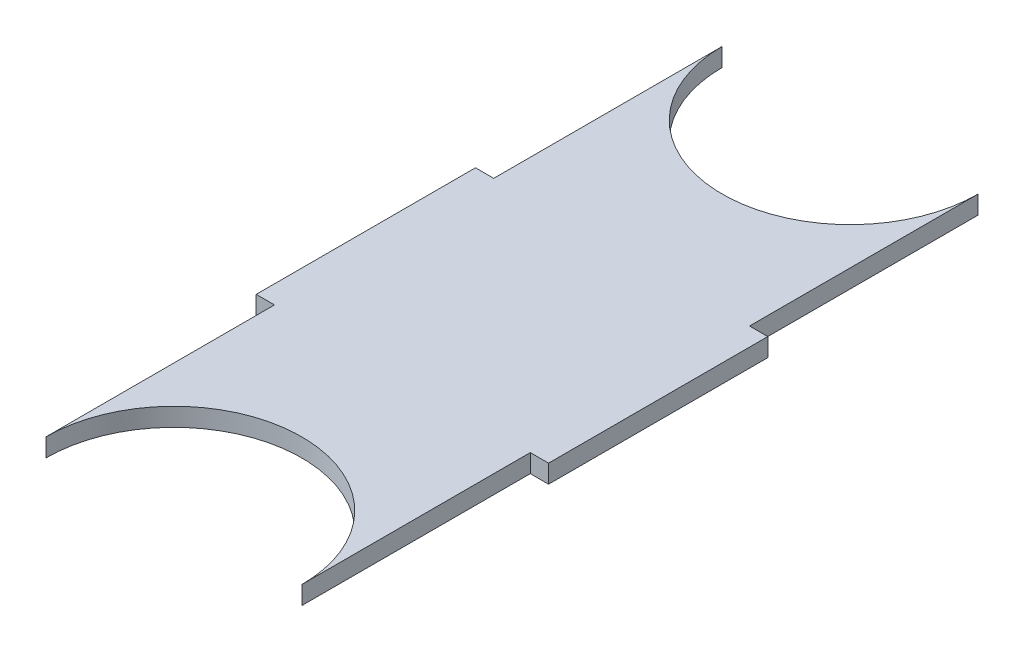
ISO-10303-21;
HEADER;
FILE_DESCRIPTION(('STEP AP214'),'2;1');
FILE_NAME('part.step','',(''),(''),'','','');
FILE_SCHEMA(('AUTOMOTIVE_DESIGN { 1 0 10303 214 1 1 1 1 }'));
ENDSEC;
DATA;
#1=APPLICATION_CONTEXT('core data for automotive mechanical design processes');
#2=APPLICATION_PROTOCOL_DEFINITION('international standard','automotive_design',2000,#1);
#3=PRODUCT_CONTEXT('',#1,'mechanical');
#4=PRODUCT('Part','Part','',(#3));
#5=PRODUCT_RELATED_PRODUCT_CATEGORY('part','',(#4));
#6=PRODUCT_DEFINITION_FORMATION('','',#4);
#7=PRODUCT_DEFINITION_CONTEXT('part definition',#1,'design');
#8=PRODUCT_DEFINITION('design','',#6,#7);
#9=PRODUCT_DEFINITION_SHAPE('','',#8);
#10=(LENGTH_UNIT() NAMED_UNIT(*) SI_UNIT(.MILLI.,.METRE.));
#11=(NAMED_UNIT(*) PLANE_ANGLE_UNIT() SI_UNIT($,.RADIAN.));
#12=(NAMED_UNIT(*) SI_UNIT($,.STERADIAN.) SOLID_ANGLE_UNIT());
#13=UNCERTAINTY_MEASURE_WITH_UNIT(LENGTH_MEASURE(1.E-05),#10,'distance_accuracy_value','');
#14=(GEOMETRIC_REPRESENTATION_CONTEXT(3) GLOBAL_UNCERTAINTY_ASSIGNED_CONTEXT((#13)) GLOBAL_UNIT_ASSIGNED_CONTEXT((#10,
#11,#12)) REPRESENTATION_CONTEXT('',''));
#15=CARTESIAN_POINT('',(0.,0.,0.));
#16=DIRECTION('',(0.,0.,1.));
#17=DIRECTION('',(1.,0.,0.));
#18=AXIS2_PLACEMENT_3D('',#15,#16,#17);
#19=CARTESIAN_POINT('',(11.1125,1.5875,0.));
#20=DIRECTION('',(1.,0.,0.));
#21=DIRECTION('',(0.,0.,-1.));
#22=AXIS2_PLACEMENT_3D('',#19,#20,#21);
#23=PLANE('',#22);
#24=DIRECTION('',(0.,0.,1.));
#25=VECTOR('',#24,1.);
#26=CARTESIAN_POINT('',(11.1125,0.,0.));
#27=LINE('',#26,#25);
#28=CARTESIAN_POINT('',(11.1125,0.,-27.7886697009627));
#29=VERTEX_POINT('',#28);
#30=CARTESIAN_POINT('',(11.1125,0.,-7.9375));
#31=VERTEX_POINT('',#30);
#32=EDGE_CURVE('E165',#29,#31,#27,.T.);
#33=ORIENTED_EDGE('',*,*,#32,.F.);
#34=DIRECTION('',(0.,-1.,0.));
#35=VECTOR('',#34,1.);
#36=CARTESIAN_POINT('',(11.1125,1.5875,-27.7886697009627));
#37=LINE('',#36,#35);
#38=CARTESIAN_POINT('',(11.1125,1.5875,-27.7886697009627));
#39=VERTEX_POINT('',#38);
#40=EDGE_CURVE('E11',#39,#29,#37,.T.);
#41=ORIENTED_EDGE('',*,*,#40,.F.);
#42=DIRECTION('',(0.,0.,1.));
#43=VECTOR('',#42,1.);
#44=CARTESIAN_POINT('',(11.1125,1.5875,0.));
#45=LINE('',#44,#43);
#46=CARTESIAN_POINT('',(11.1125,1.5875,-7.9375));
#47=VERTEX_POINT('',#46);
#48=EDGE_CURVE('E194',#39,#47,#45,.T.);
#49=ORIENTED_EDGE('',*,*,#48,.T.);
#50=DIRECTION('',(0.,-1.,0.));
#51=VECTOR('',#50,1.);
#52=CARTESIAN_POINT('',(11.1125,1.5875,-7.9375));
#53=LINE('',#52,#51);
#54=EDGE_CURVE('E58',#47,#31,#53,.T.);
#55=ORIENTED_EDGE('',*,*,#54,.T.);
#56=EDGE_LOOP('',(#33,#41,#49,#55));
#57=FACE_BOUND('',#56,.T.);
#58=ADVANCED_FACE('F41',(#57),#23,.T.);
#59=CARTESIAN_POINT('',(0.,1.5875,-27.7886697009627));
#60=DIRECTION('',(0.,-1.,0.));
#61=DIRECTION('',(0.,0.,-1.));
#62=AXIS2_PLACEMENT_3D('',#59,#60,#61);
#63=CYLINDRICAL_SURFACE('',#62,11.1125);
#64=CARTESIAN_POINT('',(0.,0.,-27.7886697009627));
#65=DIRECTION('',(0.,1.,0.));
#66=DIRECTION('',(0.,0.,1.));
#67=AXIS2_PLACEMENT_3D('',#64,#65,#66);
#68=CIRCLE('',#67,11.1125);
#69=CARTESIAN_POINT('',(-11.1125,0.,-27.7886697009627));
#70=VERTEX_POINT('',#69);
#71=EDGE_CURVE('E167',#29,#70,#68,.F.);
#72=ORIENTED_EDGE('',*,*,#71,.T.);
#73=DIRECTION('',(0.,-1.,0.));
#74=VECTOR('',#73,1.);
#75=CARTESIAN_POINT('',(-11.1125,1.5875,-27.7886697009627));
#76=LINE('',#75,#74);
#77=CARTESIAN_POINT('',(-11.1125,1.5875,-27.7886697009627));
#78=VERTEX_POINT('',#77);
#79=EDGE_CURVE('E50',#78,#70,#76,.T.);
#80=ORIENTED_EDGE('',*,*,#79,.F.);
#81=CARTESIAN_POINT('',(0.,1.5875,-27.7886697009627));
#82=DIRECTION('',(0.,1.,0.));
#83=DIRECTION('',(0.,0.,1.));
#84=AXIS2_PLACEMENT_3D('',#81,#82,#83);
#85=CIRCLE('',#84,11.1125);
#86=EDGE_CURVE('E239',#39,#78,#85,.F.);
#87=ORIENTED_EDGE('',*,*,#86,.F.);
#88=ORIENTED_EDGE('',*,*,#40,.T.);
#89=EDGE_LOOP('',(#72,#80,#87,#88));
#90=FACE_BOUND('',#89,.T.);
#91=ADVANCED_FACE('F43',(#90),#63,.F.);
#92=CARTESIAN_POINT('',(-11.1125,1.5875,0.));
#93=DIRECTION('',(1.,0.,0.));
#94=DIRECTION('',(0.,0.,-1.));
#95=AXIS2_PLACEMENT_3D('',#92,#93,#94);
#96=PLANE('',#95);
#97=DIRECTION('',(0.,0.,1.));
#98=VECTOR('',#97,1.);
#99=CARTESIAN_POINT('',(-11.1125,0.,0.));
#100=LINE('',#99,#98);
#101=CARTESIAN_POINT('',(-11.1125,0.,-7.93749999999999));
#102=VERTEX_POINT('',#101);
#103=EDGE_CURVE('E170',#70,#102,#100,.T.);
#104=ORIENTED_EDGE('',*,*,#103,.T.);
#105=DIRECTION('',(0.,-1.,0.));
#106=VECTOR('',#105,1.);
#107=CARTESIAN_POINT('',(-11.1125,1.5875,-7.93749999999999));
#108=LINE('',#107,#106);
#109=CARTESIAN_POINT('',(-11.1125,1.5875,-7.93749999999999));
#110=VERTEX_POINT('',#109);
#111=EDGE_CURVE('E211',#110,#102,#108,.T.);
#112=ORIENTED_EDGE('',*,*,#111,.F.);
#113=DIRECTION('',(0.,0.,1.));
#114=VECTOR('',#113,1.);
#115=CARTESIAN_POINT('',(-11.1125,1.5875,0.));
#116=LINE('',#115,#114);
#117=EDGE_CURVE('E220',#78,#110,#116,.T.);
#118=ORIENTED_EDGE('',*,*,#117,.F.);
#119=ORIENTED_EDGE('',*,*,#79,.T.);
#120=EDGE_LOOP('',(#104,#112,#118,#119));
#121=FACE_BOUND('',#120,.T.);
#122=ADVANCED_FACE('F218',(#121),#96,.F.);
#123=CARTESIAN_POINT('',(0.,1.5875,-7.93749999999999));
#124=DIRECTION('',(0.,0.,1.));
#125=DIRECTION('',(1.,0.,0.));
#126=AXIS2_PLACEMENT_3D('',#123,#124,#125);
#127=PLANE('',#126);
#128=DIRECTION('',(-1.,0.,0.));
#129=VECTOR('',#128,1.);
#130=CARTESIAN_POINT('',(0.,0.,-7.93749999999999));
#131=LINE('',#130,#129);
#132=CARTESIAN_POINT('',(-12.7,0.,-7.93749999999999));
#133=VERTEX_POINT('',#132);
#134=EDGE_CURVE('E172',#102,#133,#131,.T.);
#135=ORIENTED_EDGE('',*,*,#134,.T.);
#136=DIRECTION('',(0.,-1.,0.));
#137=VECTOR('',#136,1.);
#138=CARTESIAN_POINT('',(-12.7,1.5875,-7.93749999999999));
#139=LINE('',#138,#137);
#140=CARTESIAN_POINT('',(-12.7,1.5875,-7.93749999999999));
#141=VERTEX_POINT('',#140);
#142=EDGE_CURVE('E209',#141,#133,#139,.T.);
#143=ORIENTED_EDGE('',*,*,#142,.F.);
#144=DIRECTION('',(-1.,0.,0.));
#145=VECTOR('',#144,1.);
#146=CARTESIAN_POINT('',(0.,1.5875,-7.93749999999999));
#147=LINE('',#146,#145);
#148=EDGE_CURVE('E232',#110,#141,#147,.T.);
#149=ORIENTED_EDGE('',*,*,#148,.F.);
#150=ORIENTED_EDGE('',*,*,#111,.T.);
#151=EDGE_LOOP('',(#135,#143,#149,#150));
#152=FACE_BOUND('',#151,.T.);
#153=ADVANCED_FACE('F229',(#152),#127,.F.);
#154=CARTESIAN_POINT('',(-12.7,1.5875,0.));
#155=DIRECTION('',(-1.,0.,0.));
#156=DIRECTION('',(0.,0.,1.));
#157=AXIS2_PLACEMENT_3D('',#154,#155,#156);
#158=PLANE('',#157);
#159=DIRECTION('',(0.,0.,-1.));
#160=VECTOR('',#159,1.);
#161=CARTESIAN_POINT('',(-12.7,0.,0.));
#162=LINE('',#161,#160);
#163=CARTESIAN_POINT('',(-12.7,0.,11.1125));
#164=VERTEX_POINT('',#163);
#165=EDGE_CURVE('E176',#164,#133,#162,.T.);
#166=ORIENTED_EDGE('',*,*,#165,.F.);
#167=DIRECTION('',(0.,-1.,0.));
#168=VECTOR('',#167,1.);
#169=CARTESIAN_POINT('',(-12.7,1.5875,11.1125));
#170=LINE('',#169,#168);
#171=CARTESIAN_POINT('',(-12.7,1.5875,11.1125));
#172=VERTEX_POINT('',#171);
#173=EDGE_CURVE('E206',#172,#164,#170,.T.);
#174=ORIENTED_EDGE('',*,*,#173,.F.);
#175=DIRECTION('',(0.,0.,-1.));
#176=VECTOR('',#175,1.);
#177=CARTESIAN_POINT('',(-12.7,1.5875,0.));
#178=LINE('',#177,#176);
#179=EDGE_CURVE('E234',#172,#141,#178,.T.);
#180=ORIENTED_EDGE('',*,*,#179,.T.);
#181=ORIENTED_EDGE('',*,*,#142,.T.);
#182=EDGE_LOOP('',(#166,#174,#180,#181));
#183=FACE_BOUND('',#182,.T.);
#184=ADVANCED_FACE('F354',(#183),#158,.T.);
#185=CARTESIAN_POINT('',(0.,1.5875,11.1125));
#186=DIRECTION('',(0.,0.,1.));
#187=DIRECTION('',(1.,0.,0.));
#188=AXIS2_PLACEMENT_3D('',#185,#186,#187);
#189=PLANE('',#188);
#190=DIRECTION('',(-1.,0.,0.));
#191=VECTOR('',#190,1.);
#192=CARTESIAN_POINT('',(0.,0.,11.1125));
#193=LINE('',#192,#191);
#194=CARTESIAN_POINT('',(-11.1125,0.,11.1125));
#195=VERTEX_POINT('',#194);
#196=EDGE_CURVE('E180',#195,#164,#193,.T.);
#197=ORIENTED_EDGE('',*,*,#196,.F.);
#198=DIRECTION('',(0.,-1.,0.));
#199=VECTOR('',#198,1.);
#200=CARTESIAN_POINT('',(-11.1125,1.5875,11.1125));
#201=LINE('',#200,#199);
#202=CARTESIAN_POINT('',(-11.1125,1.5875,11.1125));
#203=VERTEX_POINT('',#202);
#204=EDGE_CURVE('E203',#203,#195,#201,.T.);
#205=ORIENTED_EDGE('',*,*,#204,.F.);
#206=DIRECTION('',(-1.,0.,0.));
#207=VECTOR('',#206,1.);
#208=CARTESIAN_POINT('',(0.,1.5875,11.1125));
#209=LINE('',#208,#207);
#210=EDGE_CURVE('E237',#203,#172,#209,.T.);
#211=ORIENTED_EDGE('',*,*,#210,.T.);
#212=ORIENTED_EDGE('',*,*,#173,.T.);
#213=EDGE_LOOP('',(#197,#205,#211,#212));
#214=FACE_BOUND('',#213,.T.);
#215=ADVANCED_FACE('F344',(#214),#189,.T.);
#216=CARTESIAN_POINT('',(-11.1125,0.,30.9636697009627));
#217=VERTEX_POINT('',#216);
#218=EDGE_CURVE('E173',#195,#217,#100,.T.);
#219=ORIENTED_EDGE('',*,*,#218,.T.);
#220=DIRECTION('',(0.,-1.,0.));
#221=VECTOR('',#220,1.);
#222=CARTESIAN_POINT('',(-11.1125,1.5875,30.9636697009627));
#223=LINE('',#222,#221);
#224=CARTESIAN_POINT('',(-11.1125,1.5875,30.9636697009627));
#225=VERTEX_POINT('',#224);
#226=EDGE_CURVE('E200',#225,#217,#223,.T.);
#227=ORIENTED_EDGE('',*,*,#226,.F.);
#228=EDGE_CURVE('E241',#203,#225,#116,.T.);
#229=ORIENTED_EDGE('',*,*,#228,.F.);
#230=ORIENTED_EDGE('',*,*,#204,.T.);
#231=EDGE_LOOP('',(#219,#227,#229,#230));
#232=FACE_BOUND('',#231,.T.);
#233=ADVANCED_FACE('F258',(#232),#96,.F.);
#234=CARTESIAN_POINT('',(0.,1.5875,30.9636697009627));
#235=DIRECTION('',(0.,-1.,0.));
#236=DIRECTION('',(0.,0.,-1.));
#237=AXIS2_PLACEMENT_3D('',#234,#235,#236);
#238=CYLINDRICAL_SURFACE('',#237,11.1125);
#239=CARTESIAN_POINT('',(0.,0.,30.9636697009627));
#240=DIRECTION('',(0.,1.,0.));
#241=DIRECTION('',(0.,0.,1.));
#242=AXIS2_PLACEMENT_3D('',#239,#240,#241);
#243=CIRCLE('',#242,11.1125);
#244=CARTESIAN_POINT('',(11.1125,0.,30.9636697009627));
#245=VERTEX_POINT('',#244);
#246=EDGE_CURVE('E184',#245,#217,#243,.T.);
#247=ORIENTED_EDGE('',*,*,#246,.F.);
#248=DIRECTION('',(0.,-1.,0.));
#249=VECTOR('',#248,1.);
#250=CARTESIAN_POINT('',(11.1125,1.5875,30.9636697009627));
#251=LINE('',#250,#249);
#252=CARTESIAN_POINT('',(11.1125,1.5875,30.9636697009627));
#253=VERTEX_POINT('',#252);
#254=EDGE_CURVE('E198',#253,#245,#251,.T.);
#255=ORIENTED_EDGE('',*,*,#254,.F.);
#256=CARTESIAN_POINT('',(0.,1.5875,30.9636697009627));
#257=DIRECTION('',(0.,1.,0.));
#258=DIRECTION('',(0.,0.,1.));
#259=AXIS2_PLACEMENT_3D('',#256,#257,#258);
#260=CIRCLE('',#259,11.1125);
#261=EDGE_CURVE('E246',#253,#225,#260,.T.);
#262=ORIENTED_EDGE('',*,*,#261,.T.);
#263=ORIENTED_EDGE('',*,*,#226,.T.);
#264=EDGE_LOOP('',(#247,#255,#262,#263));
#265=FACE_BOUND('',#264,.T.);
#266=ADVANCED_FACE('F261',(#265),#238,.F.);
#267=CARTESIAN_POINT('',(11.1125,0.,11.1125));
#268=VERTEX_POINT('',#267);
#269=EDGE_CURVE('E168',#268,#245,#27,.T.);
#270=ORIENTED_EDGE('',*,*,#269,.F.);
#271=DIRECTION('',(0.,-1.,0.));
#272=VECTOR('',#271,1.);
#273=CARTESIAN_POINT('',(11.1125,1.5875,11.1125));
#274=LINE('',#273,#272);
#275=CARTESIAN_POINT('',(11.1125,1.5875,11.1125));
#276=VERTEX_POINT('',#275);
#277=EDGE_CURVE('E157',#276,#268,#274,.T.);
#278=ORIENTED_EDGE('',*,*,#277,.F.);
#279=EDGE_CURVE('E147',#276,#253,#45,.T.);
#280=ORIENTED_EDGE('',*,*,#279,.T.);
#281=ORIENTED_EDGE('',*,*,#254,.T.);
#282=EDGE_LOOP('',(#270,#278,#280,#281));
#283=FACE_BOUND('',#282,.T.);
#284=ADVANCED_FACE('F266',(#283),#23,.T.);
#285=CARTESIAN_POINT('',(0.,1.5875,11.1125));
#286=DIRECTION('',(0.,0.,-1.));
#287=DIRECTION('',(-1.,0.,0.));
#288=AXIS2_PLACEMENT_3D('',#285,#286,#287);
#289=PLANE('',#288);
#290=DIRECTION('',(1.,0.,0.));
#291=VECTOR('',#290,1.);
#292=CARTESIAN_POINT('',(0.,0.,11.1125));
#293=LINE('',#292,#291);
#294=CARTESIAN_POINT('',(12.7,0.,11.1125));
#295=VERTEX_POINT('',#294);
#296=EDGE_CURVE('E154',#268,#295,#293,.T.);
#297=ORIENTED_EDGE('',*,*,#296,.T.);
#298=DIRECTION('',(0.,-1.,0.));
#299=VECTOR('',#298,1.);
#300=CARTESIAN_POINT('',(12.7,1.5875,11.1125));
#301=LINE('',#300,#299);
#302=CARTESIAN_POINT('',(12.7,1.5875,11.1125));
#303=VERTEX_POINT('',#302);
#304=EDGE_CURVE('E151',#303,#295,#301,.T.);
#305=ORIENTED_EDGE('',*,*,#304,.F.);
#306=DIRECTION('',(1.,0.,0.));
#307=VECTOR('',#306,1.);
#308=CARTESIAN_POINT('',(0.,1.5875,11.1125));
#309=LINE('',#308,#307);
#310=EDGE_CURVE('E138',#276,#303,#309,.T.);
#311=ORIENTED_EDGE('',*,*,#310,.F.);
#312=ORIENTED_EDGE('',*,*,#277,.T.);
#313=EDGE_LOOP('',(#297,#305,#311,#312));
#314=FACE_BOUND('',#313,.T.);
#315=ADVANCED_FACE('F152',(#314),#289,.F.);
#316=CARTESIAN_POINT('',(12.7,1.5875,0.));
#317=DIRECTION('',(-1.,0.,0.));
#318=DIRECTION('',(0.,0.,1.));
#319=AXIS2_PLACEMENT_3D('',#316,#317,#318);
#320=PLANE('',#319);
#321=DIRECTION('',(0.,0.,-1.));
#322=VECTOR('',#321,1.);
#323=CARTESIAN_POINT('',(12.7,0.,0.));
#324=LINE('',#323,#322);
#325=CARTESIAN_POINT('',(12.7,0.,-7.9375));
#326=VERTEX_POINT('',#325);
#327=EDGE_CURVE('E189',#295,#326,#324,.T.);
#328=ORIENTED_EDGE('',*,*,#327,.T.);
#329=DIRECTION('',(0.,-1.,0.));
#330=VECTOR('',#329,1.);
#331=CARTESIAN_POINT('',(12.7,1.5875,-7.9375));
#332=LINE('',#331,#330);
#333=CARTESIAN_POINT('',(12.7,1.5875,-7.9375));
#334=VERTEX_POINT('',#333);
#335=EDGE_CURVE('E98',#334,#326,#332,.T.);
#336=ORIENTED_EDGE('',*,*,#335,.F.);
#337=DIRECTION('',(0.,0.,-1.));
#338=VECTOR('',#337,1.);
#339=CARTESIAN_POINT('',(12.7,1.5875,0.));
#340=LINE('',#339,#338);
#341=EDGE_CURVE('E144',#303,#334,#340,.T.);
#342=ORIENTED_EDGE('',*,*,#341,.F.);
#343=ORIENTED_EDGE('',*,*,#304,.T.);
#344=EDGE_LOOP('',(#328,#336,#342,#343));
#345=FACE_BOUND('',#344,.T.);
#346=ADVANCED_FACE('F159',(#345),#320,.F.);
#347=CARTESIAN_POINT('',(0.,1.5875,-7.93749999999998));
#348=DIRECTION('',(0.,0.,-1.));
#349=DIRECTION('',(-1.,0.,0.));
#350=AXIS2_PLACEMENT_3D('',#347,#348,#349);
#351=PLANE('',#350);
#352=DIRECTION('',(1.,0.,0.));
#353=VECTOR('',#352,1.);
#354=CARTESIAN_POINT('',(0.,0.,-7.93749999999998));
#355=LINE('',#354,#353);
#356=EDGE_CURVE('E191',#31,#326,#355,.T.);
#357=ORIENTED_EDGE('',*,*,#356,.F.);
#358=ORIENTED_EDGE('',*,*,#54,.F.);
#359=DIRECTION('',(1.,0.,0.));
#360=VECTOR('',#359,1.);
#361=CARTESIAN_POINT('',(0.,1.5875,-7.93749999999998));
#362=LINE('',#361,#360);
#363=EDGE_CURVE('E160',#47,#334,#362,.T.);
#364=ORIENTED_EDGE('',*,*,#363,.T.);
#365=ORIENTED_EDGE('',*,*,#335,.T.);
#366=EDGE_LOOP('',(#357,#358,#364,#365));
#367=FACE_BOUND('',#366,.T.);
#368=ADVANCED_FACE('F279',(#367),#351,.T.);
#369=CARTESIAN_POINT('',(0.,1.5875,0.));
#370=DIRECTION('',(0.,1.,0.));
#371=DIRECTION('',(0.,0.,1.));
#372=AXIS2_PLACEMENT_3D('',#369,#370,#371);
#373=PLANE('',#372);
#374=ORIENTED_EDGE('',*,*,#48,.F.);
#375=ORIENTED_EDGE('',*,*,#86,.T.);
#376=ORIENTED_EDGE('',*,*,#117,.T.);
#377=ORIENTED_EDGE('',*,*,#148,.T.);
#378=ORIENTED_EDGE('',*,*,#179,.F.);
#379=ORIENTED_EDGE('',*,*,#210,.F.);
#380=ORIENTED_EDGE('',*,*,#228,.T.);
#381=ORIENTED_EDGE('',*,*,#261,.F.);
#382=ORIENTED_EDGE('',*,*,#279,.F.);
#383=ORIENTED_EDGE('',*,*,#310,.T.);
#384=ORIENTED_EDGE('',*,*,#341,.T.);
#385=ORIENTED_EDGE('',*,*,#363,.F.);
#386=EDGE_LOOP('',(#374,#375,#376,#377,#378,#379,#380,#381,#382,#383,#384,#385));
#387=FACE_BOUND('',#386,.T.);
#388=ADVANCED_FACE('F141',(#387),#373,.T.);
#389=CARTESIAN_POINT('',(0.,0.,0.));
#390=DIRECTION('',(0.,1.,0.));
#391=DIRECTION('',(0.,0.,1.));
#392=AXIS2_PLACEMENT_3D('',#389,#390,#391);
#393=PLANE('',#392);
#394=ORIENTED_EDGE('',*,*,#32,.T.);
#395=ORIENTED_EDGE('',*,*,#356,.T.);
#396=ORIENTED_EDGE('',*,*,#327,.F.);
#397=ORIENTED_EDGE('',*,*,#296,.F.);
#398=ORIENTED_EDGE('',*,*,#269,.T.);
#399=ORIENTED_EDGE('',*,*,#246,.T.);
#400=ORIENTED_EDGE('',*,*,#218,.F.);
#401=ORIENTED_EDGE('',*,*,#196,.T.);
#402=ORIENTED_EDGE('',*,*,#165,.T.);
#403=ORIENTED_EDGE('',*,*,#134,.F.);
#404=ORIENTED_EDGE('',*,*,#103,.F.);
#405=ORIENTED_EDGE('',*,*,#71,.F.);
#406=EDGE_LOOP('',(#394,#395,#396,#397,#398,#399,#400,#401,#402,#403,#404,#405));
#407=FACE_BOUND('',#406,.T.);
#408=ADVANCED_FACE('F225',(#407),#393,.F.);
#409=CLOSED_SHELL('',(#58,#91,#122,#153,#184,#215,#233,#266,#284,#315,#346,#368,#388,#408));
#410=MANIFOLD_SOLID_BREP('B2',#409);
#411=ADVANCED_BREP_SHAPE_REPRESENTATION('',(#18,#410),#14);
#412=SHAPE_DEFINITION_REPRESENTATION(#9,#411);
ENDSEC;
END-ISO-10303-21;
